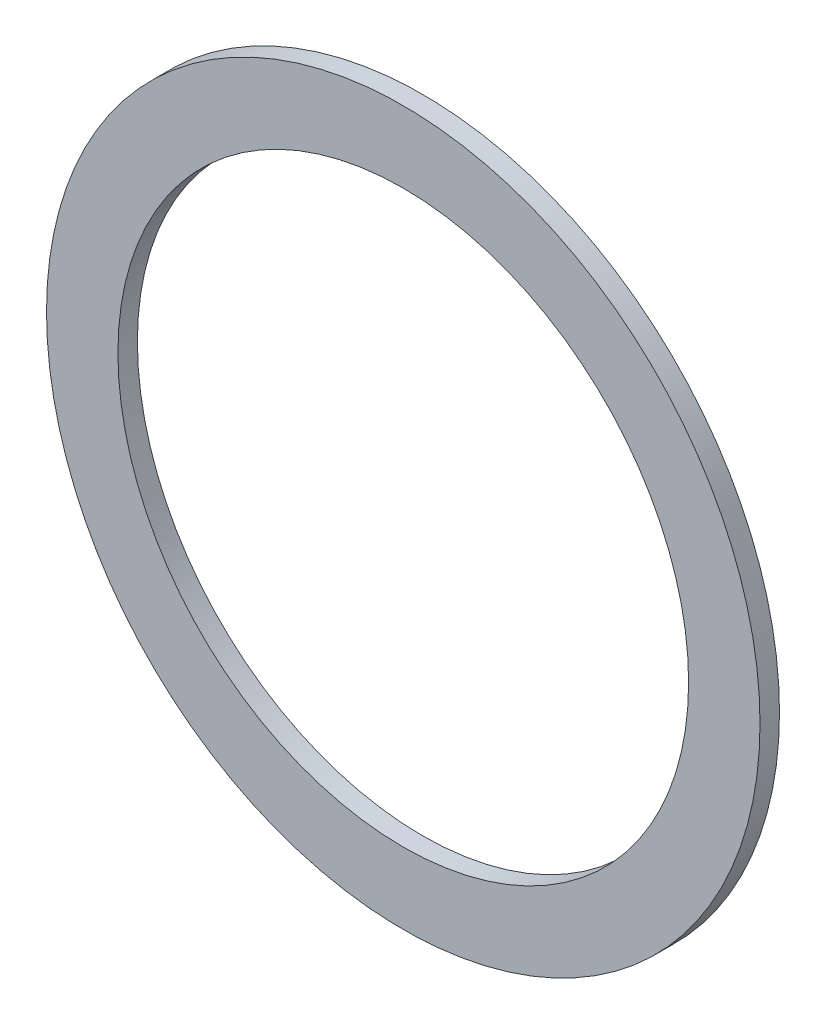
ISO-10303-21;
HEADER;
FILE_DESCRIPTION(('STEP AP214'),'2;1');
FILE_NAME('part.step','',(''),(''),'','','');
FILE_SCHEMA(('AUTOMOTIVE_DESIGN { 1 0 10303 214 1 1 1 1 }'));
ENDSEC;
DATA;
#1=APPLICATION_CONTEXT('core data for automotive mechanical design processes');
#2=APPLICATION_PROTOCOL_DEFINITION('international standard','automotive_design',2000,#1);
#3=PRODUCT_CONTEXT('',#1,'mechanical');
#4=PRODUCT('Part','Part','',(#3));
#5=PRODUCT_RELATED_PRODUCT_CATEGORY('part','',(#4));
#6=PRODUCT_DEFINITION_FORMATION('','',#4);
#7=PRODUCT_DEFINITION_CONTEXT('part definition',#1,'design');
#8=PRODUCT_DEFINITION('design','',#6,#7);
#9=PRODUCT_DEFINITION_SHAPE('','',#8);
#10=(LENGTH_UNIT() NAMED_UNIT(*) SI_UNIT(.MILLI.,.METRE.));
#11=(NAMED_UNIT(*) PLANE_ANGLE_UNIT() SI_UNIT($,.RADIAN.));
#12=(NAMED_UNIT(*) SI_UNIT($,.STERADIAN.) SOLID_ANGLE_UNIT());
#13=UNCERTAINTY_MEASURE_WITH_UNIT(LENGTH_MEASURE(1.E-05),#10,'distance_accuracy_value','');
#14=(GEOMETRIC_REPRESENTATION_CONTEXT(3) GLOBAL_UNCERTAINTY_ASSIGNED_CONTEXT((#13)) GLOBAL_UNIT_ASSIGNED_CONTEXT((#10,
#11,#12)) REPRESENTATION_CONTEXT('',''));
#15=CARTESIAN_POINT('',(0.,0.,0.));
#16=DIRECTION('',(0.,0.,1.));
#17=DIRECTION('',(1.,0.,0.));
#18=AXIS2_PLACEMENT_3D('',#15,#16,#17);
#19=CARTESIAN_POINT('',(0.,0.,1.905));
#20=DIRECTION('',(0.,0.,1.));
#21=DIRECTION('',(1.,0.,0.));
#22=AXIS2_PLACEMENT_3D('',#19,#20,#21);
#23=PLANE('',#22);
#24=CARTESIAN_POINT('',(0.,0.,1.905));
#25=DIRECTION('',(0.,0.,1.));
#26=DIRECTION('',(1.,0.,0.));
#27=AXIS2_PLACEMENT_3D('',#24,#25,#26);
#28=CIRCLE('',#27,34.8996);
#29=CARTESIAN_POINT('',(-34.8996,0.,1.905));
#30=VERTEX_POINT('',#29);
#31=EDGE_CURVE('E10',#30,#30,#28,.T.);
#32=ORIENTED_EDGE('',*,*,#31,.T.);
#33=EDGE_LOOP('',(#32));
#34=FACE_BOUND('',#33,.T.);
#35=CARTESIAN_POINT('',(0.,0.,1.905));
#36=DIRECTION('',(0.,0.,1.));
#37=DIRECTION('',(1.,0.,0.));
#38=AXIS2_PLACEMENT_3D('',#35,#36,#37);
#39=CIRCLE('',#38,27.9146);
#40=CARTESIAN_POINT('',(-27.9146,0.,1.905));
#41=VERTEX_POINT('',#40);
#42=EDGE_CURVE('E42',#41,#41,#39,.T.);
#43=ORIENTED_EDGE('',*,*,#42,.F.);
#44=EDGE_LOOP('',(#43));
#45=FACE_BOUND('',#44,.T.);
#46=ADVANCED_FACE('F31',(#34,#45),#23,.T.);
#47=CARTESIAN_POINT('',(0.,0.,0.));
#48=DIRECTION('',(0.,0.,1.));
#49=DIRECTION('',(1.,0.,0.));
#50=AXIS2_PLACEMENT_3D('',#47,#48,#49);
#51=PLANE('',#50);
#52=CARTESIAN_POINT('',(0.,0.,0.));
#53=DIRECTION('',(0.,0.,1.));
#54=DIRECTION('',(1.,0.,0.));
#55=AXIS2_PLACEMENT_3D('',#52,#53,#54);
#56=CIRCLE('',#55,34.8996);
#57=CARTESIAN_POINT('',(-34.8996,0.,0.));
#58=VERTEX_POINT('',#57);
#59=EDGE_CURVE('E35',#58,#58,#56,.T.);
#60=ORIENTED_EDGE('',*,*,#59,.F.);
#61=EDGE_LOOP('',(#60));
#62=FACE_BOUND('',#61,.T.);
#63=CARTESIAN_POINT('',(0.,0.,0.));
#64=DIRECTION('',(0.,0.,1.));
#65=DIRECTION('',(1.,0.,0.));
#66=AXIS2_PLACEMENT_3D('',#63,#64,#65);
#67=CIRCLE('',#66,27.9146);
#68=CARTESIAN_POINT('',(-27.9146,0.,0.));
#69=VERTEX_POINT('',#68);
#70=EDGE_CURVE('E44',#69,#69,#67,.T.);
#71=ORIENTED_EDGE('',*,*,#70,.T.);
#72=EDGE_LOOP('',(#71));
#73=FACE_BOUND('',#72,.T.);
#74=ADVANCED_FACE('F54',(#62,#73),#51,.F.);
#75=CARTESIAN_POINT('',(0.,0.,1.905));
#76=DIRECTION('',(0.,0.,-1.));
#77=DIRECTION('',(-1.,0.,0.));
#78=AXIS2_PLACEMENT_3D('',#75,#76,#77);
#79=CYLINDRICAL_SURFACE('',#78,34.8996);
#80=CARTESIAN_POINT('',(-34.8996,0.,1.905));
#81=CARTESIAN_POINT('',(-34.8996,0.,1.88515625));
#82=CARTESIAN_POINT('',(-34.8996,0.,1.8653125));
#83=CARTESIAN_POINT('',(-34.8996,0.,1.825625));
#84=CARTESIAN_POINT('',(-34.8996,0.,1.80578125));
#85=CARTESIAN_POINT('',(-34.8996,0.,1.76609375));
#86=CARTESIAN_POINT('',(-34.8996,0.,1.74625));
#87=CARTESIAN_POINT('',(-34.8996,0.,1.7065625));
#88=CARTESIAN_POINT('',(-34.8996,0.,1.68671875));
#89=CARTESIAN_POINT('',(-34.8996,0.,1.64703125));
#90=CARTESIAN_POINT('',(-34.8996,0.,1.6271875));
#91=CARTESIAN_POINT('',(-34.8996,0.,1.5875));
#92=CARTESIAN_POINT('',(-34.8996,0.,1.56765625));
#93=CARTESIAN_POINT('',(-34.8996,0.,1.52796875));
#94=CARTESIAN_POINT('',(-34.8996,0.,1.508125));
#95=CARTESIAN_POINT('',(-34.8996,0.,1.4684375));
#96=CARTESIAN_POINT('',(-34.8996,0.,1.44859375));
#97=CARTESIAN_POINT('',(-34.8996,0.,1.40890625));
#98=CARTESIAN_POINT('',(-34.8996,0.,1.3890625));
#99=CARTESIAN_POINT('',(-34.8996,0.,1.349375));
#100=CARTESIAN_POINT('',(-34.8996,0.,1.32953125));
#101=CARTESIAN_POINT('',(-34.8996,0.,1.28984375));
#102=CARTESIAN_POINT('',(-34.8996,0.,1.27));
#103=CARTESIAN_POINT('',(-34.8996,0.,1.2303125));
#104=CARTESIAN_POINT('',(-34.8996,0.,1.21046875));
#105=CARTESIAN_POINT('',(-34.8996,0.,1.17078125));
#106=CARTESIAN_POINT('',(-34.8996,0.,1.1509375));
#107=CARTESIAN_POINT('',(-34.8996,0.,1.11125));
#108=CARTESIAN_POINT('',(-34.8996,0.,1.09140625));
#109=CARTESIAN_POINT('',(-34.8996,0.,1.05171875));
#110=CARTESIAN_POINT('',(-34.8996,0.,1.031875));
#111=CARTESIAN_POINT('',(-34.8996,0.,0.9921875));
#112=CARTESIAN_POINT('',(-34.8996,0.,0.97234375));
#113=CARTESIAN_POINT('',(-34.8996,0.,0.93265625));
#114=CARTESIAN_POINT('',(-34.8996,0.,0.9128125));
#115=CARTESIAN_POINT('',(-34.8996,0.,0.873125));
#116=CARTESIAN_POINT('',(-34.8996,0.,0.85328125));
#117=CARTESIAN_POINT('',(-34.8996,0.,0.81359375));
#118=CARTESIAN_POINT('',(-34.8996,0.,0.79375));
#119=CARTESIAN_POINT('',(-34.8996,0.,0.7540625));
#120=CARTESIAN_POINT('',(-34.8996,0.,0.73421875));
#121=CARTESIAN_POINT('',(-34.8996,0.,0.69453125));
#122=CARTESIAN_POINT('',(-34.8996,0.,0.6746875));
#123=CARTESIAN_POINT('',(-34.8996,0.,0.635));
#124=CARTESIAN_POINT('',(-34.8996,0.,0.61515625));
#125=CARTESIAN_POINT('',(-34.8996,0.,0.57546875));
#126=CARTESIAN_POINT('',(-34.8996,0.,0.555625));
#127=CARTESIAN_POINT('',(-34.8996,0.,0.5159375));
#128=CARTESIAN_POINT('',(-34.8996,0.,0.49609375));
#129=CARTESIAN_POINT('',(-34.8996,0.,0.45640625));
#130=CARTESIAN_POINT('',(-34.8996,0.,0.4365625));
#131=CARTESIAN_POINT('',(-34.8996,0.,0.396875));
#132=CARTESIAN_POINT('',(-34.8996,0.,0.37703125));
#133=CARTESIAN_POINT('',(-34.8996,0.,0.33734375));
#134=CARTESIAN_POINT('',(-34.8996,0.,0.3175));
#135=CARTESIAN_POINT('',(-34.8996,0.,0.2778125));
#136=CARTESIAN_POINT('',(-34.8996,0.,0.25796875));
#137=CARTESIAN_POINT('',(-34.8996,0.,0.21828125));
#138=CARTESIAN_POINT('',(-34.8996,0.,0.1984375));
#139=CARTESIAN_POINT('',(-34.8996,0.,0.15875));
#140=CARTESIAN_POINT('',(-34.8996,0.,0.13890625));
#141=CARTESIAN_POINT('',(-34.8996,0.,0.09921875));
#142=CARTESIAN_POINT('',(-34.8996,0.,0.0793749999999999));
#143=CARTESIAN_POINT('',(-34.8996,0.,0.0396874999999999));
#144=CARTESIAN_POINT('',(-34.8996,0.,0.01984375));
#145=CARTESIAN_POINT('',(-34.8996,0.,0.));
#146=B_SPLINE_CURVE_WITH_KNOTS('',3,(#80,#81,#82,#83,#84,#85,#86,#87,#88,#89,#90,#91,#92,#93,
#94,#95,#96,#97,#98,#99,#100,#101,#102,#103,#104,#105,#106,#107,#108,#109,#110,#111,#112,#113,
#114,#115,#116,#117,#118,#119,#120,#121,#122,#123,#124,#125,#126,#127,#128,#129,#130,#131,#132,
#133,#134,#135,#136,#137,#138,#139,#140,#141,#142,#143,#144,#145),.UNSPECIFIED.,.F.,.F.,(4,2,2,
2,2,2,2,2,2,2,2,2,2,2,2,2,2,2,2,2,2,2,2,2,2,2,2,2,2,2,2,2,4),(0.,0.0595312499999999,0.1190625,
0.17859375,0.238125,0.29765625,0.3571875,0.41671875,0.47625,0.53578125,0.5953125,0.65484375,
0.714375,0.77390625,0.833437499999999,0.89296875,0.9525,1.01203125,1.0715625,1.13109375,
1.190625,1.25015625,1.3096875,1.36921875,1.42875,1.48828125,1.5478125,1.60734375,1.666875,
1.72640625,1.7859375,1.84546875,1.905),.UNSPECIFIED.);
#147=EDGE_CURVE('BSEAM33',#30,#58,#146,.T.);
#148=ORIENTED_EDGE('',*,*,#31,.F.);
#149=ORIENTED_EDGE('',*,*,#59,.T.);
#150=ORIENTED_EDGE('',*,*,#147,.T.);
#151=ORIENTED_EDGE('',*,*,#147,.F.);
#152=EDGE_LOOP('',(#148,#150,#149,#151));
#153=FACE_BOUND('',#152,.T.);
#154=ADVANCED_FACE('F33',(#153),#79,.T.);
#155=CARTESIAN_POINT('',(0.,0.,1.905));
#156=DIRECTION('',(0.,0.,-1.));
#157=DIRECTION('',(-1.,0.,0.));
#158=AXIS2_PLACEMENT_3D('',#155,#156,#157);
#159=CYLINDRICAL_SURFACE('',#158,27.9146);
#160=CARTESIAN_POINT('',(-27.9146,0.,1.905));
#161=CARTESIAN_POINT('',(-27.9146,0.,1.88515625));
#162=CARTESIAN_POINT('',(-27.9146,0.,1.8653125));
#163=CARTESIAN_POINT('',(-27.9146,0.,1.825625));
#164=CARTESIAN_POINT('',(-27.9146,0.,1.80578125));
#165=CARTESIAN_POINT('',(-27.9146,0.,1.76609375));
#166=CARTESIAN_POINT('',(-27.9146,0.,1.74625));
#167=CARTESIAN_POINT('',(-27.9146,0.,1.7065625));
#168=CARTESIAN_POINT('',(-27.9146,0.,1.68671875));
#169=CARTESIAN_POINT('',(-27.9146,0.,1.64703125));
#170=CARTESIAN_POINT('',(-27.9146,0.,1.6271875));
#171=CARTESIAN_POINT('',(-27.9146,0.,1.5875));
#172=CARTESIAN_POINT('',(-27.9146,0.,1.56765625));
#173=CARTESIAN_POINT('',(-27.9146,0.,1.52796875));
#174=CARTESIAN_POINT('',(-27.9146,0.,1.508125));
#175=CARTESIAN_POINT('',(-27.9146,0.,1.4684375));
#176=CARTESIAN_POINT('',(-27.9146,0.,1.44859375));
#177=CARTESIAN_POINT('',(-27.9146,0.,1.40890625));
#178=CARTESIAN_POINT('',(-27.9146,0.,1.3890625));
#179=CARTESIAN_POINT('',(-27.9146,0.,1.349375));
#180=CARTESIAN_POINT('',(-27.9146,0.,1.32953125));
#181=CARTESIAN_POINT('',(-27.9146,0.,1.28984375));
#182=CARTESIAN_POINT('',(-27.9146,0.,1.27));
#183=CARTESIAN_POINT('',(-27.9146,0.,1.2303125));
#184=CARTESIAN_POINT('',(-27.9146,0.,1.21046875));
#185=CARTESIAN_POINT('',(-27.9146,0.,1.17078125));
#186=CARTESIAN_POINT('',(-27.9146,0.,1.1509375));
#187=CARTESIAN_POINT('',(-27.9146,0.,1.11125));
#188=CARTESIAN_POINT('',(-27.9146,0.,1.09140625));
#189=CARTESIAN_POINT('',(-27.9146,0.,1.05171875));
#190=CARTESIAN_POINT('',(-27.9146,0.,1.031875));
#191=CARTESIAN_POINT('',(-27.9146,0.,0.9921875));
#192=CARTESIAN_POINT('',(-27.9146,0.,0.97234375));
#193=CARTESIAN_POINT('',(-27.9146,0.,0.93265625));
#194=CARTESIAN_POINT('',(-27.9146,0.,0.9128125));
#195=CARTESIAN_POINT('',(-27.9146,0.,0.873125));
#196=CARTESIAN_POINT('',(-27.9146,0.,0.85328125));
#197=CARTESIAN_POINT('',(-27.9146,0.,0.81359375));
#198=CARTESIAN_POINT('',(-27.9146,0.,0.79375));
#199=CARTESIAN_POINT('',(-27.9146,0.,0.7540625));
#200=CARTESIAN_POINT('',(-27.9146,0.,0.73421875));
#201=CARTESIAN_POINT('',(-27.9146,0.,0.69453125));
#202=CARTESIAN_POINT('',(-27.9146,0.,0.6746875));
#203=CARTESIAN_POINT('',(-27.9146,0.,0.635));
#204=CARTESIAN_POINT('',(-27.9146,0.,0.61515625));
#205=CARTESIAN_POINT('',(-27.9146,0.,0.57546875));
#206=CARTESIAN_POINT('',(-27.9146,0.,0.555625));
#207=CARTESIAN_POINT('',(-27.9146,0.,0.5159375));
#208=CARTESIAN_POINT('',(-27.9146,0.,0.49609375));
#209=CARTESIAN_POINT('',(-27.9146,0.,0.45640625));
#210=CARTESIAN_POINT('',(-27.9146,0.,0.4365625));
#211=CARTESIAN_POINT('',(-27.9146,0.,0.396875));
#212=CARTESIAN_POINT('',(-27.9146,0.,0.37703125));
#213=CARTESIAN_POINT('',(-27.9146,0.,0.33734375));
#214=CARTESIAN_POINT('',(-27.9146,0.,0.3175));
#215=CARTESIAN_POINT('',(-27.9146,0.,0.2778125));
#216=CARTESIAN_POINT('',(-27.9146,0.,0.25796875));
#217=CARTESIAN_POINT('',(-27.9146,0.,0.21828125));
#218=CARTESIAN_POINT('',(-27.9146,0.,0.1984375));
#219=CARTESIAN_POINT('',(-27.9146,0.,0.15875));
#220=CARTESIAN_POINT('',(-27.9146,0.,0.13890625));
#221=CARTESIAN_POINT('',(-27.9146,0.,0.09921875));
#222=CARTESIAN_POINT('',(-27.9146,0.,0.0793749999999999));
#223=CARTESIAN_POINT('',(-27.9146,0.,0.0396874999999999));
#224=CARTESIAN_POINT('',(-27.9146,0.,0.01984375));
#225=CARTESIAN_POINT('',(-27.9146,0.,0.));
#226=B_SPLINE_CURVE_WITH_KNOTS('',3,(#160,#161,#162,#163,#164,#165,#166,#167,#168,#169,#170,
#171,#172,#173,#174,#175,#176,#177,#178,#179,#180,#181,#182,#183,#184,#185,#186,#187,#188,#189,
#190,#191,#192,#193,#194,#195,#196,#197,#198,#199,#200,#201,#202,#203,#204,#205,#206,#207,#208,
#209,#210,#211,#212,#213,#214,#215,#216,#217,#218,#219,#220,#221,#222,#223,#224,#225),
.UNSPECIFIED.,.F.,.F.,(4,2,2,2,2,2,2,2,2,2,2,2,2,2,2,2,2,2,2,2,2,2,2,2,2,2,2,2,2,2,2,2,4),(0.,
0.0595312500000001,0.1190625,0.17859375,0.238125,0.29765625,0.3571875,0.41671875,0.47625,
0.53578125,0.5953125,0.65484375,0.714375,0.77390625,0.8334375,0.89296875,0.9525,1.01203125,
1.0715625,1.13109375,1.190625,1.25015625,1.3096875,1.36921875,1.42875,1.48828125,1.5478125,
1.60734375,1.666875,1.72640625,1.7859375,1.84546875,1.905),.UNSPECIFIED.);
#227=EDGE_CURVE('BSEAM50',#41,#69,#226,.T.);
#228=ORIENTED_EDGE('',*,*,#42,.T.);
#229=ORIENTED_EDGE('',*,*,#70,.F.);
#230=ORIENTED_EDGE('',*,*,#227,.T.);
#231=ORIENTED_EDGE('',*,*,#227,.F.);
#232=EDGE_LOOP('',(#228,#230,#229,#231));
#233=FACE_BOUND('',#232,.T.);
#234=ADVANCED_FACE('F50',(#233),#159,.F.);
#235=CLOSED_SHELL('',(#46,#74,#154,#234));
#236=MANIFOLD_SOLID_BREP('B2',#235);
#237=ADVANCED_BREP_SHAPE_REPRESENTATION('',(#18,#236),#14);
#238=SHAPE_DEFINITION_REPRESENTATION(#9,#237);
ENDSEC;
END-ISO-10303-21;
